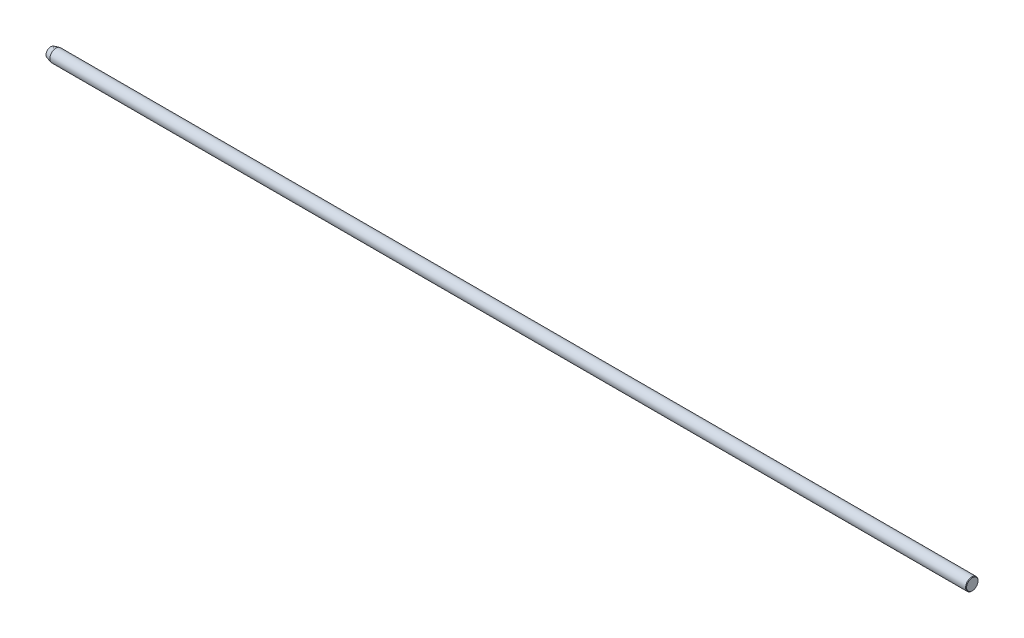
ISO-10303-21;
HEADER;
FILE_DESCRIPTION(('STEP AP214'),'2;1');
FILE_NAME('part.step','',(''),(''),'','','');
FILE_SCHEMA(('AUTOMOTIVE_DESIGN { 1 0 10303 214 1 1 1 1 }'));
ENDSEC;
DATA;
#1=APPLICATION_CONTEXT('core data for automotive mechanical design processes');
#2=APPLICATION_PROTOCOL_DEFINITION('international standard','automotive_design',2000,#1);
#3=PRODUCT_CONTEXT('',#1,'mechanical');
#4=PRODUCT('Part','Part','',(#3));
#5=PRODUCT_RELATED_PRODUCT_CATEGORY('part','',(#4));
#6=PRODUCT_DEFINITION_FORMATION('','',#4);
#7=PRODUCT_DEFINITION_CONTEXT('part definition',#1,'design');
#8=PRODUCT_DEFINITION('design','',#6,#7);
#9=PRODUCT_DEFINITION_SHAPE('','',#8);
#10=(LENGTH_UNIT() NAMED_UNIT(*) SI_UNIT(.MILLI.,.METRE.));
#11=(NAMED_UNIT(*) PLANE_ANGLE_UNIT() SI_UNIT($,.RADIAN.));
#12=(NAMED_UNIT(*) SI_UNIT($,.STERADIAN.) SOLID_ANGLE_UNIT());
#13=UNCERTAINTY_MEASURE_WITH_UNIT(LENGTH_MEASURE(1.E-05),#10,'distance_accuracy_value','');
#14=(GEOMETRIC_REPRESENTATION_CONTEXT(3) GLOBAL_UNCERTAINTY_ASSIGNED_CONTEXT((#13)) GLOBAL_UNIT_ASSIGNED_CONTEXT((#10,
#11,#12)) REPRESENTATION_CONTEXT('',''));
#15=CARTESIAN_POINT('',(0.,0.,0.));
#16=DIRECTION('',(0.,0.,1.));
#17=DIRECTION('',(1.,0.,0.));
#18=AXIS2_PLACEMENT_3D('',#15,#16,#17);
#19=CARTESIAN_POINT('',(186.,-5.5,-5.5));
#20=DIRECTION('',(1.,0.,0.));
#21=DIRECTION('',(0.,1.,0.));
#22=AXIS2_PLACEMENT_3D('',#19,#20,#21);
#23=PLANE('',#22);
#24=CARTESIAN_POINT('',(186.,0.,0.));
#25=DIRECTION('',(1.,0.,0.));
#26=DIRECTION('',(0.,0.,1.));
#27=AXIS2_PLACEMENT_3D('',#24,#25,#26);
#28=CIRCLE('',#27,5.5);
#29=CARTESIAN_POINT('',(186.,0.,5.5));
#30=VERTEX_POINT('',#29);
#31=EDGE_CURVE('E49',#30,#30,#28,.T.);
#32=ORIENTED_EDGE('',*,*,#31,.T.);
#33=EDGE_LOOP('',(#32));
#34=FACE_BOUND('',#33,.T.);
#35=ADVANCED_FACE('F42',(#34),#23,.T.);
#36=CARTESIAN_POINT('',(186.,0.,0.));
#37=DIRECTION('',(1.,0.,0.));
#38=DIRECTION('',(0.,0.,1.));
#39=AXIS2_PLACEMENT_3D('',#36,#37,#38);
#40=CYLINDRICAL_SURFACE('',#39,6.);
#41=CARTESIAN_POINT('',(185.5,0.,0.));
#42=DIRECTION('',(-1.,0.,0.));
#43=DIRECTION('',(0.,0.,-1.));
#44=AXIS2_PLACEMENT_3D('',#41,#42,#43);
#45=CIRCLE('',#44,6.);
#46=CARTESIAN_POINT('',(185.5,0.,-6.));
#47=VERTEX_POINT('',#46);
#48=EDGE_CURVE('E11',#47,#47,#45,.F.);
#49=ORIENTED_EDGE('',*,*,#48,.F.);
#50=EDGE_LOOP('',(#49));
#51=FACE_BOUND('',#50,.T.);
#52=CARTESIAN_POINT('',(-700.,0.,0.));
#53=DIRECTION('',(1.,0.,0.));
#54=DIRECTION('',(0.,0.,1.));
#55=AXIS2_PLACEMENT_3D('',#52,#53,#54);
#56=CIRCLE('',#55,6.);
#57=CARTESIAN_POINT('',(-700.,0.,6.));
#58=VERTEX_POINT('',#57);
#59=EDGE_CURVE('E57',#58,#58,#56,.T.);
#60=ORIENTED_EDGE('',*,*,#59,.T.);
#61=EDGE_LOOP('',(#60));
#62=FACE_BOUND('',#61,.T.);
#63=ADVANCED_FACE('F63',(#51,#62),#40,.T.);
#64=CARTESIAN_POINT('',(185.5,0.,0.));
#65=DIRECTION('',(-1.,0.,0.));
#66=DIRECTION('',(0.,0.,-1.));
#67=AXIS2_PLACEMENT_3D('',#64,#65,#66);
#68=CONICAL_SURFACE('',#67,6.,0.785398163397447);
#69=ORIENTED_EDGE('',*,*,#31,.F.);
#70=EDGE_LOOP('',(#69));
#71=FACE_BOUND('',#70,.T.);
#72=ORIENTED_EDGE('',*,*,#48,.T.);
#73=EDGE_LOOP('',(#72));
#74=FACE_BOUND('',#73,.T.);
#75=ADVANCED_FACE('F44',(#71,#74),#68,.T.);
#76=CARTESIAN_POINT('',(-705.,-4.66025403784444,4.6602543950392));
#77=DIRECTION('',(-1.,0.,0.));
#78=DIRECTION('',(0.,1.,0.));
#79=AXIS2_PLACEMENT_3D('',#76,#77,#78);
#80=PLANE('',#79);
#81=CARTESIAN_POINT('',(-705.,0.,0.));
#82=DIRECTION('',(-1.,0.,0.));
#83=DIRECTION('',(0.,0.,-1.));
#84=AXIS2_PLACEMENT_3D('',#81,#82,#83);
#85=CIRCLE('',#84,4.6602540378444);
#86=CARTESIAN_POINT('',(-705.,0.,-4.6602540378444));
#87=VERTEX_POINT('',#86);
#88=EDGE_CURVE('E53',#87,#87,#85,.F.);
#89=ORIENTED_EDGE('',*,*,#88,.F.);
#90=EDGE_LOOP('',(#89));
#91=FACE_BOUND('',#90,.T.);
#92=ADVANCED_FACE('F67',(#91),#80,.T.);
#93=CARTESIAN_POINT('',(-700.,0.,0.));
#94=DIRECTION('',(1.,0.,0.));
#95=DIRECTION('',(0.,1.41823430011352E-07,0.99999999999999));
#96=AXIS2_PLACEMENT_3D('',#93,#94,#95);
#97=CONICAL_SURFACE('',#96,6.00000000000001,0.261799387799154);
#98=ORIENTED_EDGE('',*,*,#88,.T.);
#99=EDGE_LOOP('',(#98));
#100=FACE_BOUND('',#99,.T.);
#101=ORIENTED_EDGE('',*,*,#59,.F.);
#102=EDGE_LOOP('',(#101));
#103=FACE_BOUND('',#102,.T.);
#104=ADVANCED_FACE('F65',(#100,#103),#97,.T.);
#105=CLOSED_SHELL('',(#35,#63,#75,#92,#104));
#106=MANIFOLD_SOLID_BREP('B2',#105);
#107=ADVANCED_BREP_SHAPE_REPRESENTATION('',(#18,#106),#14);
#108=SHAPE_DEFINITION_REPRESENTATION(#9,#107);
ENDSEC;
END-ISO-10303-21;
